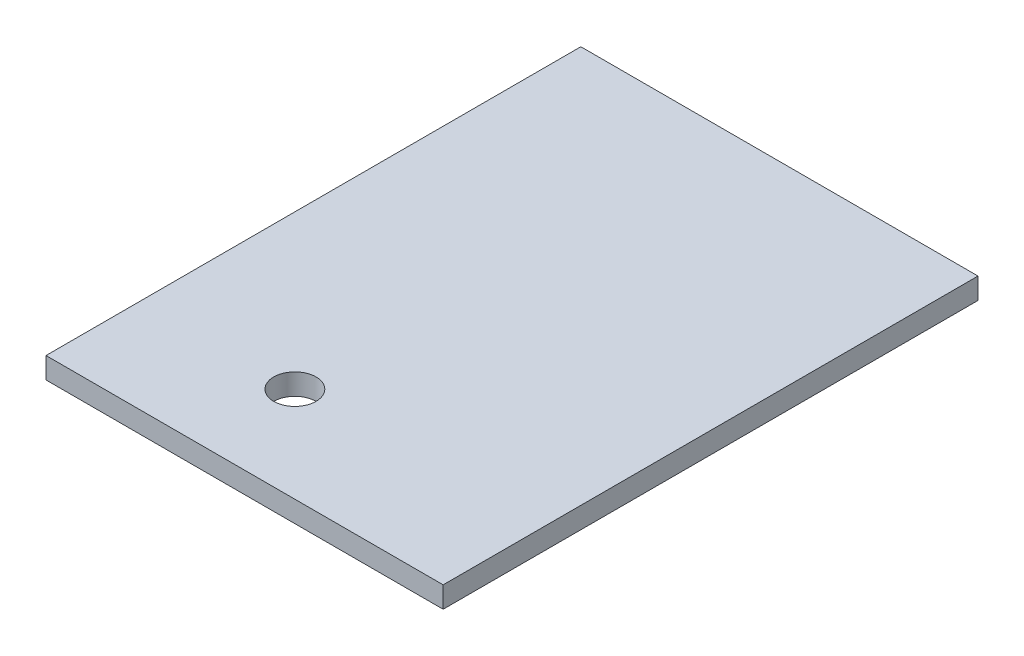
ISO-10303-21;
HEADER;
FILE_DESCRIPTION(('STEP AP214'),'2;1');
FILE_NAME('part.step','',(''),(''),'','','');
FILE_SCHEMA(('AUTOMOTIVE_DESIGN { 1 0 10303 214 1 1 1 1 }'));
ENDSEC;
DATA;
#1=APPLICATION_CONTEXT('core data for automotive mechanical design processes');
#2=APPLICATION_PROTOCOL_DEFINITION('international standard','automotive_design',2000,#1);
#3=PRODUCT_CONTEXT('',#1,'mechanical');
#4=PRODUCT('Part','Part','',(#3));
#5=PRODUCT_RELATED_PRODUCT_CATEGORY('part','',(#4));
#6=PRODUCT_DEFINITION_FORMATION('','',#4);
#7=PRODUCT_DEFINITION_CONTEXT('part definition',#1,'design');
#8=PRODUCT_DEFINITION('design','',#6,#7);
#9=PRODUCT_DEFINITION_SHAPE('','',#8);
#10=(LENGTH_UNIT() NAMED_UNIT(*) SI_UNIT(.MILLI.,.METRE.));
#11=(NAMED_UNIT(*) PLANE_ANGLE_UNIT() SI_UNIT($,.RADIAN.));
#12=(NAMED_UNIT(*) SI_UNIT($,.STERADIAN.) SOLID_ANGLE_UNIT());
#13=UNCERTAINTY_MEASURE_WITH_UNIT(LENGTH_MEASURE(1.E-05),#10,'distance_accuracy_value','');
#14=(GEOMETRIC_REPRESENTATION_CONTEXT(3) GLOBAL_UNCERTAINTY_ASSIGNED_CONTEXT((#13)) GLOBAL_UNIT_ASSIGNED_CONTEXT((#10,
#11,#12)) REPRESENTATION_CONTEXT('',''));
#15=CARTESIAN_POINT('',(0.,0.,0.));
#16=DIRECTION('',(0.,0.,1.));
#17=DIRECTION('',(1.,0.,0.));
#18=AXIS2_PLACEMENT_3D('',#15,#16,#17);
#19=CARTESIAN_POINT('',(-18.75,2.,25.25));
#20=DIRECTION('',(1.,0.,0.));
#21=DIRECTION('',(0.,0.,-1.));
#22=AXIS2_PLACEMENT_3D('',#19,#20,#21);
#23=PLANE('',#22);
#24=DIRECTION('',(0.,0.,1.));
#25=VECTOR('',#24,1.);
#26=CARTESIAN_POINT('',(-18.75,0.,25.25));
#27=LINE('',#26,#25);
#28=CARTESIAN_POINT('',(-18.75,0.,-25.25));
#29=VERTEX_POINT('',#28);
#30=CARTESIAN_POINT('',(-18.75,0.,25.25));
#31=VERTEX_POINT('',#30);
#32=EDGE_CURVE('E99',#29,#31,#27,.T.);
#33=ORIENTED_EDGE('',*,*,#32,.T.);
#34=DIRECTION('',(0.,-1.,0.));
#35=VECTOR('',#34,1.);
#36=CARTESIAN_POINT('',(-18.75,2.,25.25));
#37=LINE('',#36,#35);
#38=CARTESIAN_POINT('',(-18.75,2.,25.25));
#39=VERTEX_POINT('',#38);
#40=EDGE_CURVE('E11',#39,#31,#37,.T.);
#41=ORIENTED_EDGE('',*,*,#40,.F.);
#42=DIRECTION('',(0.,0.,1.));
#43=VECTOR('',#42,1.);
#44=CARTESIAN_POINT('',(-18.75,2.,25.25));
#45=LINE('',#44,#43);
#46=CARTESIAN_POINT('',(-18.75,2.,-25.25));
#47=VERTEX_POINT('',#46);
#48=EDGE_CURVE('E87',#47,#39,#45,.T.);
#49=ORIENTED_EDGE('',*,*,#48,.F.);
#50=DIRECTION('',(0.,-1.,0.));
#51=VECTOR('',#50,1.);
#52=CARTESIAN_POINT('',(-18.75,2.,-25.25));
#53=LINE('',#52,#51);
#54=EDGE_CURVE('E95',#47,#29,#53,.T.);
#55=ORIENTED_EDGE('',*,*,#54,.T.);
#56=EDGE_LOOP('',(#33,#41,#49,#55));
#57=FACE_BOUND('',#56,.T.);
#58=ADVANCED_FACE('F36',(#57),#23,.F.);
#59=CARTESIAN_POINT('',(18.75,2.,25.25));
#60=DIRECTION('',(0.,0.,-1.));
#61=DIRECTION('',(-1.,0.,0.));
#62=AXIS2_PLACEMENT_3D('',#59,#60,#61);
#63=PLANE('',#62);
#64=DIRECTION('',(1.,0.,0.));
#65=VECTOR('',#64,1.);
#66=CARTESIAN_POINT('',(18.75,0.,25.25));
#67=LINE('',#66,#65);
#68=CARTESIAN_POINT('',(18.75,0.,25.25));
#69=VERTEX_POINT('',#68);
#70=EDGE_CURVE('E91',#31,#69,#67,.T.);
#71=ORIENTED_EDGE('',*,*,#70,.T.);
#72=DIRECTION('',(0.,-1.,0.));
#73=VECTOR('',#72,1.);
#74=CARTESIAN_POINT('',(18.75,2.,25.25));
#75=LINE('',#74,#73);
#76=CARTESIAN_POINT('',(18.75,2.,25.25));
#77=VERTEX_POINT('',#76);
#78=EDGE_CURVE('E44',#77,#69,#75,.T.);
#79=ORIENTED_EDGE('',*,*,#78,.F.);
#80=DIRECTION('',(1.,0.,0.));
#81=VECTOR('',#80,1.);
#82=CARTESIAN_POINT('',(18.75,2.,25.25));
#83=LINE('',#82,#81);
#84=EDGE_CURVE('E82',#39,#77,#83,.T.);
#85=ORIENTED_EDGE('',*,*,#84,.F.);
#86=ORIENTED_EDGE('',*,*,#40,.T.);
#87=EDGE_LOOP('',(#71,#79,#85,#86));
#88=FACE_BOUND('',#87,.T.);
#89=ADVANCED_FACE('F90',(#88),#63,.F.);
#90=CARTESIAN_POINT('',(18.75,2.,25.25));
#91=DIRECTION('',(-1.,0.,0.));
#92=DIRECTION('',(0.,0.,1.));
#93=AXIS2_PLACEMENT_3D('',#90,#91,#92);
#94=PLANE('',#93);
#95=DIRECTION('',(0.,0.,-1.));
#96=VECTOR('',#95,1.);
#97=CARTESIAN_POINT('',(18.75,0.,25.25));
#98=LINE('',#97,#96);
#99=CARTESIAN_POINT('',(18.75,0.,-25.25));
#100=VERTEX_POINT('',#99);
#101=EDGE_CURVE('E69',#69,#100,#98,.T.);
#102=ORIENTED_EDGE('',*,*,#101,.T.);
#103=DIRECTION('',(0.,-1.,0.));
#104=VECTOR('',#103,1.);
#105=CARTESIAN_POINT('',(18.75,2.,-25.25));
#106=LINE('',#105,#104);
#107=CARTESIAN_POINT('',(18.75,2.,-25.25));
#108=VERTEX_POINT('',#107);
#109=EDGE_CURVE('E92',#108,#100,#106,.T.);
#110=ORIENTED_EDGE('',*,*,#109,.F.);
#111=DIRECTION('',(0.,0.,-1.));
#112=VECTOR('',#111,1.);
#113=CARTESIAN_POINT('',(18.75,2.,25.25));
#114=LINE('',#113,#112);
#115=EDGE_CURVE('E85',#77,#108,#114,.T.);
#116=ORIENTED_EDGE('',*,*,#115,.F.);
#117=ORIENTED_EDGE('',*,*,#78,.T.);
#118=EDGE_LOOP('',(#102,#110,#116,#117));
#119=FACE_BOUND('',#118,.T.);
#120=ADVANCED_FACE('F93',(#119),#94,.F.);
#121=CARTESIAN_POINT('',(18.75,2.,-25.25));
#122=DIRECTION('',(0.,0.,1.));
#123=DIRECTION('',(1.,0.,0.));
#124=AXIS2_PLACEMENT_3D('',#121,#122,#123);
#125=PLANE('',#124);
#126=DIRECTION('',(-1.,0.,0.));
#127=VECTOR('',#126,1.);
#128=CARTESIAN_POINT('',(18.75,0.,-25.25));
#129=LINE('',#128,#127);
#130=EDGE_CURVE('E75',#100,#29,#129,.T.);
#131=ORIENTED_EDGE('',*,*,#130,.T.);
#132=ORIENTED_EDGE('',*,*,#54,.F.);
#133=DIRECTION('',(-1.,0.,0.));
#134=VECTOR('',#133,1.);
#135=CARTESIAN_POINT('',(18.75,2.,-25.25));
#136=LINE('',#135,#134);
#137=EDGE_CURVE('E52',#108,#47,#136,.T.);
#138=ORIENTED_EDGE('',*,*,#137,.F.);
#139=ORIENTED_EDGE('',*,*,#109,.T.);
#140=EDGE_LOOP('',(#131,#132,#138,#139));
#141=FACE_BOUND('',#140,.T.);
#142=ADVANCED_FACE('F107',(#141),#125,.F.);
#143=CARTESIAN_POINT('',(0.,2.,0.));
#144=DIRECTION('',(0.,1.,0.));
#145=DIRECTION('',(0.,0.,1.));
#146=AXIS2_PLACEMENT_3D('',#143,#144,#145);
#147=PLANE('',#146);
#148=CARTESIAN_POINT('',(-4.25,2.,16.25));
#149=DIRECTION('',(0.,1.,0.));
#150=DIRECTION('',(0.,0.,1.));
#151=AXIS2_PLACEMENT_3D('',#148,#149,#150);
#152=CIRCLE('',#151,2.);
#153=CARTESIAN_POINT('',(-4.25,2.,18.25));
#154=VERTEX_POINT('',#153);
#155=EDGE_CURVE('E113',#154,#154,#152,.T.);
#156=ORIENTED_EDGE('',*,*,#155,.F.);
#157=EDGE_LOOP('',(#156));
#158=FACE_BOUND('',#157,.T.);
#159=ORIENTED_EDGE('',*,*,#48,.T.);
#160=ORIENTED_EDGE('',*,*,#84,.T.);
#161=ORIENTED_EDGE('',*,*,#115,.T.);
#162=ORIENTED_EDGE('',*,*,#137,.T.);
#163=EDGE_LOOP('',(#159,#160,#161,#162));
#164=FACE_BOUND('',#163,.T.);
#165=ADVANCED_FACE('F83',(#158,#164),#147,.T.);
#166=CARTESIAN_POINT('',(0.,0.,0.));
#167=DIRECTION('',(0.,1.,0.));
#168=DIRECTION('',(0.,0.,1.));
#169=AXIS2_PLACEMENT_3D('',#166,#167,#168);
#170=PLANE('',#169);
#171=CARTESIAN_POINT('',(-4.25,0.,16.25));
#172=DIRECTION('',(0.,1.,0.));
#173=DIRECTION('',(0.,0.,1.));
#174=AXIS2_PLACEMENT_3D('',#171,#172,#173);
#175=CIRCLE('',#174,2.);
#176=CARTESIAN_POINT('',(-4.25,0.,18.25));
#177=VERTEX_POINT('',#176);
#178=EDGE_CURVE('E102',#177,#177,#175,.T.);
#179=ORIENTED_EDGE('',*,*,#178,.T.);
#180=EDGE_LOOP('',(#179));
#181=FACE_BOUND('',#180,.T.);
#182=ORIENTED_EDGE('',*,*,#32,.F.);
#183=ORIENTED_EDGE('',*,*,#130,.F.);
#184=ORIENTED_EDGE('',*,*,#101,.F.);
#185=ORIENTED_EDGE('',*,*,#70,.F.);
#186=EDGE_LOOP('',(#182,#183,#184,#185));
#187=FACE_BOUND('',#186,.T.);
#188=ADVANCED_FACE('F110',(#181,#187),#170,.F.);
#189=CARTESIAN_POINT('',(-4.25,0.,16.25));
#190=DIRECTION('',(0.,1.,0.));
#191=DIRECTION('',(0.,0.,1.));
#192=AXIS2_PLACEMENT_3D('',#189,#190,#191);
#193=CYLINDRICAL_SURFACE('',#192,2.);
#194=ORIENTED_EDGE('',*,*,#178,.F.);
#195=EDGE_LOOP('',(#194));
#196=FACE_BOUND('',#195,.T.);
#197=ORIENTED_EDGE('',*,*,#155,.T.);
#198=EDGE_LOOP('',(#197));
#199=FACE_BOUND('',#198,.T.);
#200=ADVANCED_FACE('F120',(#196,#199),#193,.F.);
#201=CLOSED_SHELL('',(#58,#89,#120,#142,#165,#188,#200));
#202=MANIFOLD_SOLID_BREP('B2',#201);
#203=ADVANCED_BREP_SHAPE_REPRESENTATION('',(#18,#202),#14);
#204=SHAPE_DEFINITION_REPRESENTATION(#9,#203);
ENDSEC;
END-ISO-10303-21;
